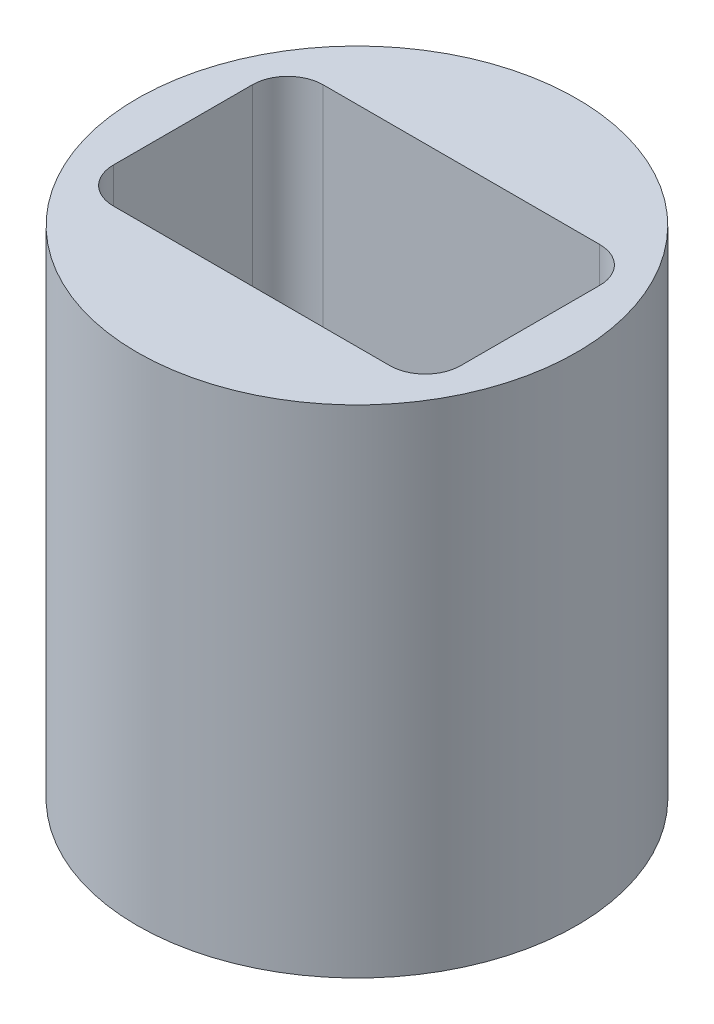
ISO-10303-21;
HEADER;
FILE_DESCRIPTION(('STEP AP214'),'2;1');
FILE_NAME('part.step','',(''),(''),'','','');
FILE_SCHEMA(('AUTOMOTIVE_DESIGN { 1 0 10303 214 1 1 1 1 }'));
ENDSEC;
DATA;
#1=APPLICATION_CONTEXT('core data for automotive mechanical design processes');
#2=APPLICATION_PROTOCOL_DEFINITION('international standard','automotive_design',2000,#1);
#3=PRODUCT_CONTEXT('',#1,'mechanical');
#4=PRODUCT('Part','Part','',(#3));
#5=PRODUCT_RELATED_PRODUCT_CATEGORY('part','',(#4));
#6=PRODUCT_DEFINITION_FORMATION('','',#4);
#7=PRODUCT_DEFINITION_CONTEXT('part definition',#1,'design');
#8=PRODUCT_DEFINITION('design','',#6,#7);
#9=PRODUCT_DEFINITION_SHAPE('','',#8);
#10=(LENGTH_UNIT() NAMED_UNIT(*) SI_UNIT(.MILLI.,.METRE.));
#11=(NAMED_UNIT(*) PLANE_ANGLE_UNIT() SI_UNIT($,.RADIAN.));
#12=(NAMED_UNIT(*) SI_UNIT($,.STERADIAN.) SOLID_ANGLE_UNIT());
#13=UNCERTAINTY_MEASURE_WITH_UNIT(LENGTH_MEASURE(1.E-05),#10,'distance_accuracy_value','');
#14=(GEOMETRIC_REPRESENTATION_CONTEXT(3) GLOBAL_UNCERTAINTY_ASSIGNED_CONTEXT((#13)) GLOBAL_UNIT_ASSIGNED_CONTEXT((#10,
#11,#12)) REPRESENTATION_CONTEXT('',''));
#15=CARTESIAN_POINT('',(0.,0.,0.));
#16=DIRECTION('',(0.,0.,1.));
#17=DIRECTION('',(1.,0.,0.));
#18=AXIS2_PLACEMENT_3D('',#15,#16,#17);
#19=CARTESIAN_POINT('',(0.,7.,0.));
#20=DIRECTION('',(0.,-1.,0.));
#21=DIRECTION('',(0.,0.,-1.));
#22=AXIS2_PLACEMENT_3D('',#19,#20,#21);
#23=CYLINDRICAL_SURFACE('',#22,3.1);
#24=CARTESIAN_POINT('',(0.,7.,0.));
#25=DIRECTION('',(0.,1.,0.));
#26=DIRECTION('',(0.,0.,1.));
#27=AXIS2_PLACEMENT_3D('',#24,#25,#26);
#28=CIRCLE('',#27,3.1);
#29=CARTESIAN_POINT('',(0.,7.,3.1));
#30=VERTEX_POINT('',#29);
#31=EDGE_CURVE('E11',#30,#30,#28,.T.);
#32=ORIENTED_EDGE('',*,*,#31,.F.);
#33=EDGE_LOOP('',(#32));
#34=FACE_BOUND('',#33,.T.);
#35=CARTESIAN_POINT('',(0.,0.,0.));
#36=DIRECTION('',(0.,1.,0.));
#37=DIRECTION('',(0.,0.,1.));
#38=AXIS2_PLACEMENT_3D('',#35,#36,#37);
#39=CIRCLE('',#38,3.1);
#40=CARTESIAN_POINT('',(0.,0.,3.1));
#41=VERTEX_POINT('',#40);
#42=EDGE_CURVE('E36',#41,#41,#39,.T.);
#43=ORIENTED_EDGE('',*,*,#42,.T.);
#44=EDGE_LOOP('',(#43));
#45=FACE_BOUND('',#44,.T.);
#46=ADVANCED_FACE('F33',(#34,#45),#23,.T.);
#47=CARTESIAN_POINT('',(0.,7.,0.));
#48=DIRECTION('',(0.,1.,0.));
#49=DIRECTION('',(0.,0.,1.));
#50=AXIS2_PLACEMENT_3D('',#47,#48,#49);
#51=PLANE('',#50);
#52=CARTESIAN_POINT('',(-1.95627036425816,7.,-0.98));
#53=DIRECTION('',(0.,1.,0.));
#54=DIRECTION('',(0.,0.,-1.));
#55=AXIS2_PLACEMENT_3D('',#52,#53,#54);
#56=CIRCLE('',#55,0.5);
#57=CARTESIAN_POINT('',(-1.95627036425815,7.,-1.48));
#58=VERTEX_POINT('',#57);
#59=CARTESIAN_POINT('',(-2.45627036425816,7.,-0.979999999999996));
#60=VERTEX_POINT('',#59);
#61=EDGE_CURVE('E47',#58,#60,#56,.T.);
#62=ORIENTED_EDGE('',*,*,#61,.F.);
#63=DIRECTION('',(-1.,0.,0.));
#64=VECTOR('',#63,1.);
#65=CARTESIAN_POINT('',(-1.95627036425815,7.,-1.48));
#66=LINE('',#65,#64);
#67=CARTESIAN_POINT('',(1.94372963574184,7.,-1.48));
#68=VERTEX_POINT('',#67);
#69=EDGE_CURVE('E116',#68,#58,#66,.T.);
#70=ORIENTED_EDGE('',*,*,#69,.F.);
#71=CARTESIAN_POINT('',(1.94372963574184,7.,-0.98));
#72=DIRECTION('',(0.,1.,0.));
#73=DIRECTION('',(0.,0.,1.));
#74=AXIS2_PLACEMENT_3D('',#71,#72,#73);
#75=CIRCLE('',#74,0.5);
#76=CARTESIAN_POINT('',(2.44372963574184,7.,-0.979999999999996));
#77=VERTEX_POINT('',#76);
#78=EDGE_CURVE('E119',#77,#68,#75,.T.);
#79=ORIENTED_EDGE('',*,*,#78,.F.);
#80=DIRECTION('',(0.,0.,-1.));
#81=VECTOR('',#80,1.);
#82=CARTESIAN_POINT('',(2.44372963574185,7.,0.979999999999997));
#83=LINE('',#82,#81);
#84=CARTESIAN_POINT('',(2.44372963574185,7.,0.979999999999997));
#85=VERTEX_POINT('',#84);
#86=EDGE_CURVE('E147',#85,#77,#83,.T.);
#87=ORIENTED_EDGE('',*,*,#86,.F.);
#88=CARTESIAN_POINT('',(1.94372963574185,7.,0.98));
#89=DIRECTION('',(0.,1.,0.));
#90=DIRECTION('',(0.,0.,-1.));
#91=AXIS2_PLACEMENT_3D('',#88,#89,#90);
#92=CIRCLE('',#91,0.5);
#93=CARTESIAN_POINT('',(1.94372963574184,7.,1.48));
#94=VERTEX_POINT('',#93);
#95=EDGE_CURVE('E144',#94,#85,#92,.T.);
#96=ORIENTED_EDGE('',*,*,#95,.F.);
#97=DIRECTION('',(1.,0.,0.));
#98=VECTOR('',#97,1.);
#99=CARTESIAN_POINT('',(-1.95627036425815,7.,1.48));
#100=LINE('',#99,#98);
#101=CARTESIAN_POINT('',(-1.95627036425815,7.,1.48));
#102=VERTEX_POINT('',#101);
#103=EDGE_CURVE('E141',#102,#94,#100,.T.);
#104=ORIENTED_EDGE('',*,*,#103,.F.);
#105=CARTESIAN_POINT('',(-1.95627036425815,7.,0.98));
#106=DIRECTION('',(0.,1.,0.));
#107=DIRECTION('',(0.,0.,1.));
#108=AXIS2_PLACEMENT_3D('',#105,#106,#107);
#109=CIRCLE('',#108,0.5);
#110=CARTESIAN_POINT('',(-2.45627036425815,7.,0.979999999999997));
#111=VERTEX_POINT('',#110);
#112=EDGE_CURVE('E138',#111,#102,#109,.T.);
#113=ORIENTED_EDGE('',*,*,#112,.F.);
#114=DIRECTION('',(0.,0.,1.));
#115=VECTOR('',#114,1.);
#116=CARTESIAN_POINT('',(-2.45627036425815,7.,0.979999999999997));
#117=LINE('',#116,#115);
#118=EDGE_CURVE('E136',#60,#111,#117,.T.);
#119=ORIENTED_EDGE('',*,*,#118,.F.);
#120=EDGE_LOOP('',(#62,#70,#79,#87,#96,#104,#113,#119));
#121=FACE_BOUND('',#120,.T.);
#122=ORIENTED_EDGE('',*,*,#31,.T.);
#123=EDGE_LOOP('',(#122));
#124=FACE_BOUND('',#123,.T.);
#125=ADVANCED_FACE('F168',(#121,#124),#51,.T.);
#126=CARTESIAN_POINT('',(0.,0.,0.));
#127=DIRECTION('',(0.,1.,0.));
#128=DIRECTION('',(0.,0.,1.));
#129=AXIS2_PLACEMENT_3D('',#126,#127,#128);
#130=PLANE('',#129);
#131=DIRECTION('',(-1.,0.,0.));
#132=VECTOR('',#131,1.);
#133=CARTESIAN_POINT('',(-1.95627036425815,0.,-1.48));
#134=LINE('',#133,#132);
#135=CARTESIAN_POINT('',(1.94372963574184,0.,-1.48));
#136=VERTEX_POINT('',#135);
#137=CARTESIAN_POINT('',(-1.95627036425815,0.,-1.48));
#138=VERTEX_POINT('',#137);
#139=EDGE_CURVE('E105',#136,#138,#134,.T.);
#140=ORIENTED_EDGE('',*,*,#139,.T.);
#141=CARTESIAN_POINT('',(-1.95627036425816,0.,-0.98));
#142=DIRECTION('',(0.,1.,0.));
#143=DIRECTION('',(0.,0.,-1.));
#144=AXIS2_PLACEMENT_3D('',#141,#142,#143);
#145=CIRCLE('',#144,0.5);
#146=CARTESIAN_POINT('',(-2.45627036425816,0.,-0.979999999999996));
#147=VERTEX_POINT('',#146);
#148=EDGE_CURVE('E99',#138,#147,#145,.T.);
#149=ORIENTED_EDGE('',*,*,#148,.T.);
#150=DIRECTION('',(0.,0.,1.));
#151=VECTOR('',#150,1.);
#152=CARTESIAN_POINT('',(-2.45627036425815,0.,0.979999999999997));
#153=LINE('',#152,#151);
#154=CARTESIAN_POINT('',(-2.45627036425815,0.,0.979999999999997));
#155=VERTEX_POINT('',#154);
#156=EDGE_CURVE('E108',#147,#155,#153,.T.);
#157=ORIENTED_EDGE('',*,*,#156,.T.);
#158=CARTESIAN_POINT('',(-1.95627036425815,0.,0.98));
#159=DIRECTION('',(0.,1.,0.));
#160=DIRECTION('',(0.,0.,1.));
#161=AXIS2_PLACEMENT_3D('',#158,#159,#160);
#162=CIRCLE('',#161,0.5);
#163=CARTESIAN_POINT('',(-1.95627036425815,0.,1.48));
#164=VERTEX_POINT('',#163);
#165=EDGE_CURVE('E55',#155,#164,#162,.T.);
#166=ORIENTED_EDGE('',*,*,#165,.T.);
#167=DIRECTION('',(1.,0.,0.));
#168=VECTOR('',#167,1.);
#169=CARTESIAN_POINT('',(-1.95627036425815,0.,1.48));
#170=LINE('',#169,#168);
#171=CARTESIAN_POINT('',(1.94372963574184,0.,1.48));
#172=VERTEX_POINT('',#171);
#173=EDGE_CURVE('E123',#164,#172,#170,.T.);
#174=ORIENTED_EDGE('',*,*,#173,.T.);
#175=CARTESIAN_POINT('',(1.94372963574185,0.,0.98));
#176=DIRECTION('',(0.,1.,0.));
#177=DIRECTION('',(0.,0.,-1.));
#178=AXIS2_PLACEMENT_3D('',#175,#176,#177);
#179=CIRCLE('',#178,0.5);
#180=CARTESIAN_POINT('',(2.44372963574185,0.,0.979999999999997));
#181=VERTEX_POINT('',#180);
#182=EDGE_CURVE('E126',#172,#181,#179,.T.);
#183=ORIENTED_EDGE('',*,*,#182,.T.);
#184=DIRECTION('',(0.,0.,-1.));
#185=VECTOR('',#184,1.);
#186=CARTESIAN_POINT('',(2.44372963574185,0.,0.979999999999997));
#187=LINE('',#186,#185);
#188=CARTESIAN_POINT('',(2.44372963574184,0.,-0.979999999999996));
#189=VERTEX_POINT('',#188);
#190=EDGE_CURVE('E129',#181,#189,#187,.T.);
#191=ORIENTED_EDGE('',*,*,#190,.T.);
#192=CARTESIAN_POINT('',(1.94372963574184,0.,-0.98));
#193=DIRECTION('',(0.,1.,0.));
#194=DIRECTION('',(0.,0.,1.));
#195=AXIS2_PLACEMENT_3D('',#192,#193,#194);
#196=CIRCLE('',#195,0.5);
#197=EDGE_CURVE('E132',#189,#136,#196,.T.);
#198=ORIENTED_EDGE('',*,*,#197,.T.);
#199=EDGE_LOOP('',(#140,#149,#157,#166,#174,#183,#191,#198));
#200=FACE_BOUND('',#199,.T.);
#201=ORIENTED_EDGE('',*,*,#42,.F.);
#202=EDGE_LOOP('',(#201));
#203=FACE_BOUND('',#202,.T.);
#204=ADVANCED_FACE('F112',(#200,#203),#130,.F.);
#205=CARTESIAN_POINT('',(-1.95627036425816,0.,-0.98));
#206=DIRECTION('',(0.,1.,0.));
#207=DIRECTION('',(0.,0.,1.));
#208=AXIS2_PLACEMENT_3D('',#205,#206,#207);
#209=CYLINDRICAL_SURFACE('',#208,0.5);
#210=ORIENTED_EDGE('',*,*,#61,.T.);
#211=DIRECTION('',(0.,1.,0.));
#212=VECTOR('',#211,1.);
#213=CARTESIAN_POINT('',(-2.45627036425816,0.,-0.979999999999996));
#214=LINE('',#213,#212);
#215=EDGE_CURVE('E95',#147,#60,#214,.T.);
#216=ORIENTED_EDGE('',*,*,#215,.F.);
#217=ORIENTED_EDGE('',*,*,#148,.F.);
#218=DIRECTION('',(0.,1.,0.));
#219=VECTOR('',#218,1.);
#220=CARTESIAN_POINT('',(-1.95627036425815,0.,-1.48));
#221=LINE('',#220,#219);
#222=EDGE_CURVE('E152',#138,#58,#221,.T.);
#223=ORIENTED_EDGE('',*,*,#222,.T.);
#224=EDGE_LOOP('',(#210,#216,#217,#223));
#225=FACE_BOUND('',#224,.T.);
#226=ADVANCED_FACE('F97',(#225),#209,.F.);
#227=CARTESIAN_POINT('',(-1.95627036425815,0.,-1.48));
#228=DIRECTION('',(0.,0.,-1.));
#229=DIRECTION('',(-1.,0.,0.));
#230=AXIS2_PLACEMENT_3D('',#227,#228,#229);
#231=PLANE('',#230);
#232=ORIENTED_EDGE('',*,*,#69,.T.);
#233=ORIENTED_EDGE('',*,*,#222,.F.);
#234=ORIENTED_EDGE('',*,*,#139,.F.);
#235=DIRECTION('',(0.,1.,0.));
#236=VECTOR('',#235,1.);
#237=CARTESIAN_POINT('',(1.94372963574184,0.,-1.48));
#238=LINE('',#237,#236);
#239=EDGE_CURVE('E154',#136,#68,#238,.T.);
#240=ORIENTED_EDGE('',*,*,#239,.T.);
#241=EDGE_LOOP('',(#232,#233,#234,#240));
#242=FACE_BOUND('',#241,.T.);
#243=ADVANCED_FACE('F187',(#242),#231,.F.);
#244=CARTESIAN_POINT('',(1.94372963574184,0.,-0.98));
#245=DIRECTION('',(0.,1.,0.));
#246=DIRECTION('',(0.,0.,1.));
#247=AXIS2_PLACEMENT_3D('',#244,#245,#246);
#248=CYLINDRICAL_SURFACE('',#247,0.5);
#249=ORIENTED_EDGE('',*,*,#78,.T.);
#250=ORIENTED_EDGE('',*,*,#239,.F.);
#251=ORIENTED_EDGE('',*,*,#197,.F.);
#252=DIRECTION('',(0.,1.,0.));
#253=VECTOR('',#252,1.);
#254=CARTESIAN_POINT('',(2.44372963574184,0.,-0.979999999999996));
#255=LINE('',#254,#253);
#256=EDGE_CURVE('E156',#189,#77,#255,.T.);
#257=ORIENTED_EDGE('',*,*,#256,.T.);
#258=EDGE_LOOP('',(#249,#250,#251,#257));
#259=FACE_BOUND('',#258,.T.);
#260=ADVANCED_FACE('F184',(#259),#248,.F.);
#261=CARTESIAN_POINT('',(2.44372963574185,0.,0.979999999999997));
#262=DIRECTION('',(1.,0.,0.));
#263=DIRECTION('',(0.,0.,-1.));
#264=AXIS2_PLACEMENT_3D('',#261,#262,#263);
#265=PLANE('',#264);
#266=ORIENTED_EDGE('',*,*,#86,.T.);
#267=ORIENTED_EDGE('',*,*,#256,.F.);
#268=ORIENTED_EDGE('',*,*,#190,.F.);
#269=DIRECTION('',(0.,1.,0.));
#270=VECTOR('',#269,1.);
#271=CARTESIAN_POINT('',(2.44372963574185,0.,0.979999999999997));
#272=LINE('',#271,#270);
#273=EDGE_CURVE('E158',#181,#85,#272,.T.);
#274=ORIENTED_EDGE('',*,*,#273,.T.);
#275=EDGE_LOOP('',(#266,#267,#268,#274));
#276=FACE_BOUND('',#275,.T.);
#277=ADVANCED_FACE('F180',(#276),#265,.F.);
#278=CARTESIAN_POINT('',(1.94372963574185,0.,0.98));
#279=DIRECTION('',(0.,1.,0.));
#280=DIRECTION('',(0.,0.,1.));
#281=AXIS2_PLACEMENT_3D('',#278,#279,#280);
#282=CYLINDRICAL_SURFACE('',#281,0.5);
#283=ORIENTED_EDGE('',*,*,#95,.T.);
#284=ORIENTED_EDGE('',*,*,#273,.F.);
#285=ORIENTED_EDGE('',*,*,#182,.F.);
#286=DIRECTION('',(0.,1.,0.));
#287=VECTOR('',#286,1.);
#288=CARTESIAN_POINT('',(1.94372963574184,0.,1.48));
#289=LINE('',#288,#287);
#290=EDGE_CURVE('E160',#172,#94,#289,.T.);
#291=ORIENTED_EDGE('',*,*,#290,.T.);
#292=EDGE_LOOP('',(#283,#284,#285,#291));
#293=FACE_BOUND('',#292,.T.);
#294=ADVANCED_FACE('F178',(#293),#282,.F.);
#295=CARTESIAN_POINT('',(-1.95627036425815,0.,1.48));
#296=DIRECTION('',(0.,0.,1.));
#297=DIRECTION('',(1.,0.,0.));
#298=AXIS2_PLACEMENT_3D('',#295,#296,#297);
#299=PLANE('',#298);
#300=ORIENTED_EDGE('',*,*,#103,.T.);
#301=ORIENTED_EDGE('',*,*,#290,.F.);
#302=ORIENTED_EDGE('',*,*,#173,.F.);
#303=DIRECTION('',(0.,1.,0.));
#304=VECTOR('',#303,1.);
#305=CARTESIAN_POINT('',(-1.95627036425815,0.,1.48));
#306=LINE('',#305,#304);
#307=EDGE_CURVE('E162',#164,#102,#306,.T.);
#308=ORIENTED_EDGE('',*,*,#307,.T.);
#309=EDGE_LOOP('',(#300,#301,#302,#308));
#310=FACE_BOUND('',#309,.T.);
#311=ADVANCED_FACE('F173',(#310),#299,.F.);
#312=CARTESIAN_POINT('',(-1.95627036425815,0.,0.98));
#313=DIRECTION('',(0.,1.,0.));
#314=DIRECTION('',(0.,0.,1.));
#315=AXIS2_PLACEMENT_3D('',#312,#313,#314);
#316=CYLINDRICAL_SURFACE('',#315,0.5);
#317=ORIENTED_EDGE('',*,*,#112,.T.);
#318=ORIENTED_EDGE('',*,*,#307,.F.);
#319=ORIENTED_EDGE('',*,*,#165,.F.);
#320=DIRECTION('',(0.,1.,0.));
#321=VECTOR('',#320,1.);
#322=CARTESIAN_POINT('',(-2.45627036425815,0.,0.979999999999997));
#323=LINE('',#322,#321);
#324=EDGE_CURVE('E104',#155,#111,#323,.T.);
#325=ORIENTED_EDGE('',*,*,#324,.T.);
#326=EDGE_LOOP('',(#317,#318,#319,#325));
#327=FACE_BOUND('',#326,.T.);
#328=ADVANCED_FACE('F164',(#327),#316,.F.);
#329=CARTESIAN_POINT('',(-2.45627036425815,0.,0.979999999999997));
#330=DIRECTION('',(-1.,0.,0.));
#331=DIRECTION('',(0.,0.,1.));
#332=AXIS2_PLACEMENT_3D('',#329,#330,#331);
#333=PLANE('',#332);
#334=ORIENTED_EDGE('',*,*,#118,.T.);
#335=ORIENTED_EDGE('',*,*,#324,.F.);
#336=ORIENTED_EDGE('',*,*,#156,.F.);
#337=ORIENTED_EDGE('',*,*,#215,.T.);
#338=EDGE_LOOP('',(#334,#335,#336,#337));
#339=FACE_BOUND('',#338,.T.);
#340=ADVANCED_FACE('F109',(#339),#333,.F.);
#341=CLOSED_SHELL('',(#46,#125,#204,#226,#243,#260,#277,#294,#311,#328,#340));
#342=MANIFOLD_SOLID_BREP('B2',#341);
#343=ADVANCED_BREP_SHAPE_REPRESENTATION('',(#18,#342),#14);
#344=SHAPE_DEFINITION_REPRESENTATION(#9,#343);
ENDSEC;
END-ISO-10303-21;
